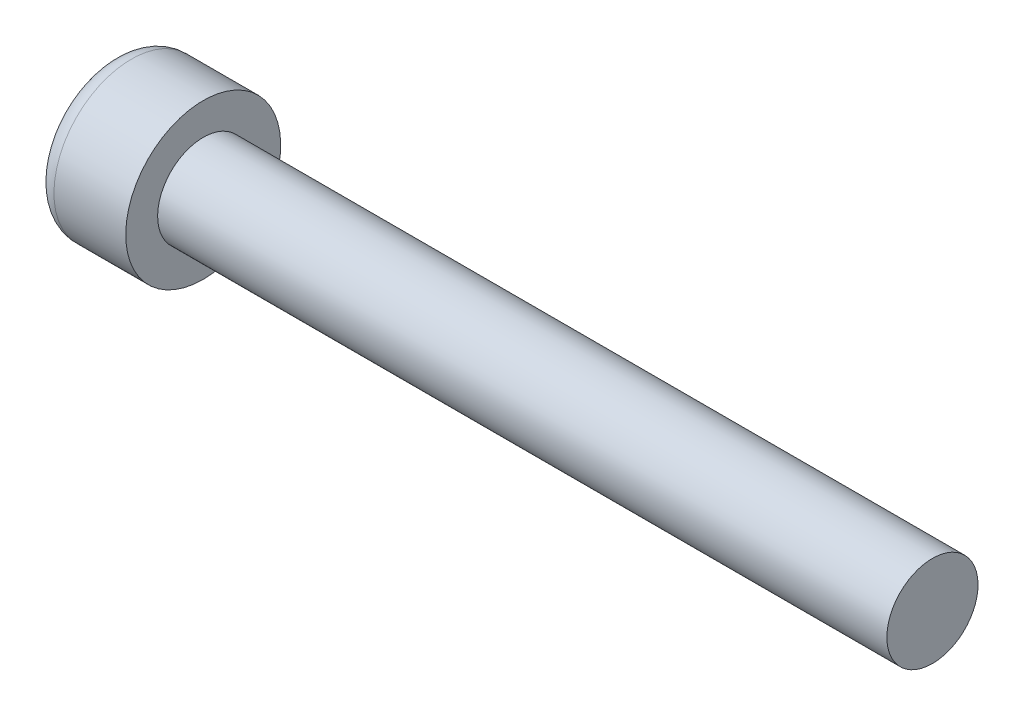
ISO-10303-21;
HEADER;
FILE_DESCRIPTION(('STEP AP214'),'2;1');
FILE_NAME('part.step','',(''),(''),'','','');
FILE_SCHEMA(('AUTOMOTIVE_DESIGN { 1 0 10303 214 1 1 1 1 }'));
ENDSEC;
DATA;
#1=APPLICATION_CONTEXT('core data for automotive mechanical design processes');
#2=APPLICATION_PROTOCOL_DEFINITION('international standard','automotive_design',2000,#1);
#3=PRODUCT_CONTEXT('',#1,'mechanical');
#4=PRODUCT('Part','Part','',(#3));
#5=PRODUCT_RELATED_PRODUCT_CATEGORY('part','',(#4));
#6=PRODUCT_DEFINITION_FORMATION('','',#4);
#7=PRODUCT_DEFINITION_CONTEXT('part definition',#1,'design');
#8=PRODUCT_DEFINITION('design','',#6,#7);
#9=PRODUCT_DEFINITION_SHAPE('','',#8);
#10=(LENGTH_UNIT() NAMED_UNIT(*) SI_UNIT(.MILLI.,.METRE.));
#11=(NAMED_UNIT(*) PLANE_ANGLE_UNIT() SI_UNIT($,.RADIAN.));
#12=(NAMED_UNIT(*) SI_UNIT($,.STERADIAN.) SOLID_ANGLE_UNIT());
#13=UNCERTAINTY_MEASURE_WITH_UNIT(LENGTH_MEASURE(1.E-05),#10,'distance_accuracy_value','');
#14=(GEOMETRIC_REPRESENTATION_CONTEXT(3) GLOBAL_UNCERTAINTY_ASSIGNED_CONTEXT((#13)) GLOBAL_UNIT_ASSIGNED_CONTEXT((#10,
#11,#12)) REPRESENTATION_CONTEXT('',''));
#15=CARTESIAN_POINT('',(0.,0.,0.));
#16=DIRECTION('',(0.,0.,1.));
#17=DIRECTION('',(1.,0.,0.));
#18=AXIS2_PLACEMENT_3D('',#15,#16,#17);
#19=CARTESIAN_POINT('',(0.,0.,0.));
#20=DIRECTION('',(1.,0.,0.));
#21=DIRECTION('',(0.,1.,0.));
#22=AXIS2_PLACEMENT_3D('',#19,#20,#21);
#23=PLANE('',#22);
#24=DIRECTION('',(0.,-0.5,-0.866025403784439));
#25=VECTOR('',#24,1.);
#26=CARTESIAN_POINT('',(0.,2.3094010767585,0.));
#27=LINE('',#26,#25);
#28=CARTESIAN_POINT('',(0.,2.3094010767585,0.));
#29=VERTEX_POINT('',#28);
#30=CARTESIAN_POINT('',(0.,1.15470053837925,-2.));
#31=VERTEX_POINT('',#30);
#32=EDGE_CURVE('E121',#29,#31,#27,.T.);
#33=ORIENTED_EDGE('',*,*,#32,.F.);
#34=DIRECTION('',(0.,0.5,-0.866025403784439));
#35=VECTOR('',#34,1.);
#36=CARTESIAN_POINT('',(0.,1.15470053837925,2.));
#37=LINE('',#36,#35);
#38=CARTESIAN_POINT('',(0.,1.15470053837925,2.));
#39=VERTEX_POINT('',#38);
#40=EDGE_CURVE('E47',#39,#29,#37,.T.);
#41=ORIENTED_EDGE('',*,*,#40,.F.);
#42=DIRECTION('',(0.,1.,0.));
#43=VECTOR('',#42,1.);
#44=CARTESIAN_POINT('',(0.,-1.15470053837925,2.));
#45=LINE('',#44,#43);
#46=CARTESIAN_POINT('',(0.,-1.15470053837925,2.));
#47=VERTEX_POINT('',#46);
#48=EDGE_CURVE('E130',#47,#39,#45,.T.);
#49=ORIENTED_EDGE('',*,*,#48,.F.);
#50=DIRECTION('',(0.,0.5,0.866025403784439));
#51=VECTOR('',#50,1.);
#52=CARTESIAN_POINT('',(0.,-2.3094010767585,0.));
#53=LINE('',#52,#51);
#54=CARTESIAN_POINT('',(0.,-2.3094010767585,0.));
#55=VERTEX_POINT('',#54);
#56=EDGE_CURVE('E128',#55,#47,#53,.T.);
#57=ORIENTED_EDGE('',*,*,#56,.F.);
#58=DIRECTION('',(0.,-0.5,0.866025403784439));
#59=VECTOR('',#58,1.);
#60=CARTESIAN_POINT('',(0.,-1.15470053837925,-2.));
#61=LINE('',#60,#59);
#62=CARTESIAN_POINT('',(0.,-1.15470053837925,-2.));
#63=VERTEX_POINT('',#62);
#64=EDGE_CURVE('E95',#63,#55,#61,.T.);
#65=ORIENTED_EDGE('',*,*,#64,.F.);
#66=DIRECTION('',(0.,-1.,0.));
#67=VECTOR('',#66,1.);
#68=CARTESIAN_POINT('',(0.,1.15470053837925,-2.));
#69=LINE('',#68,#67);
#70=EDGE_CURVE('E124',#31,#63,#69,.T.);
#71=ORIENTED_EDGE('',*,*,#70,.F.);
#72=EDGE_LOOP('',(#33,#41,#49,#57,#65,#71));
#73=FACE_BOUND('',#72,.T.);
#74=CARTESIAN_POINT('',(0.,0.,0.));
#75=DIRECTION('',(-1.,0.,0.));
#76=DIRECTION('',(0.,-1.,0.));
#77=AXIS2_PLACEMENT_3D('',#74,#75,#76);
#78=CIRCLE('',#77,3.1875);
#79=CARTESIAN_POINT('',(0.,-3.1875,0.));
#80=VERTEX_POINT('',#79);
#81=EDGE_CURVE('E11',#80,#80,#78,.T.);
#82=ORIENTED_EDGE('',*,*,#81,.T.);
#83=EDGE_LOOP('',(#82));
#84=FACE_BOUND('',#83,.T.);
#85=ADVANCED_FACE('F33',(#73,#84),#23,.F.);
#86=CARTESIAN_POINT('',(1.0625,0.,0.));
#87=DIRECTION('',(-1.,0.,0.));
#88=DIRECTION('',(0.,-1.,0.));
#89=AXIS2_PLACEMENT_3D('',#86,#87,#88);
#90=TOROIDAL_SURFACE('',#89,3.1875,1.0625);
#91=ORIENTED_EDGE('',*,*,#81,.F.);
#92=EDGE_LOOP('',(#91));
#93=FACE_BOUND('',#92,.T.);
#94=CARTESIAN_POINT('',(1.0625,0.,0.));
#95=DIRECTION('',(-1.,0.,0.));
#96=DIRECTION('',(0.,-1.,0.));
#97=AXIS2_PLACEMENT_3D('',#94,#95,#96);
#98=CIRCLE('',#97,4.25);
#99=CARTESIAN_POINT('',(1.0625,-4.25,0.));
#100=VERTEX_POINT('',#99);
#101=EDGE_CURVE('E40',#100,#100,#98,.T.);
#102=ORIENTED_EDGE('',*,*,#101,.T.);
#103=EDGE_LOOP('',(#102));
#104=FACE_BOUND('',#103,.T.);
#105=ADVANCED_FACE('F150',(#93,#104),#90,.T.);
#106=CARTESIAN_POINT('',(0.,0.,0.));
#107=DIRECTION('',(-1.,0.,0.));
#108=DIRECTION('',(0.,-1.,0.));
#109=AXIS2_PLACEMENT_3D('',#106,#107,#108);
#110=CYLINDRICAL_SURFACE('',#109,4.25);
#111=ORIENTED_EDGE('',*,*,#101,.F.);
#112=EDGE_LOOP('',(#111));
#113=FACE_BOUND('',#112,.T.);
#114=CARTESIAN_POINT('',(5.,0.,0.));
#115=DIRECTION('',(-1.,0.,0.));
#116=DIRECTION('',(0.,-1.,0.));
#117=AXIS2_PLACEMENT_3D('',#114,#115,#116);
#118=CIRCLE('',#117,4.25);
#119=CARTESIAN_POINT('',(5.,-4.25,0.));
#120=VERTEX_POINT('',#119);
#121=EDGE_CURVE('E145',#120,#120,#118,.T.);
#122=ORIENTED_EDGE('',*,*,#121,.T.);
#123=EDGE_LOOP('',(#122));
#124=FACE_BOUND('',#123,.T.);
#125=ADVANCED_FACE('F152',(#113,#124),#110,.T.);
#126=CARTESIAN_POINT('',(5.,4.25,0.));
#127=DIRECTION('',(-1.,0.,0.));
#128=DIRECTION('',(0.,-1.,0.));
#129=AXIS2_PLACEMENT_3D('',#126,#127,#128);
#130=PLANE('',#129);
#131=ORIENTED_EDGE('',*,*,#121,.F.);
#132=EDGE_LOOP('',(#131));
#133=FACE_BOUND('',#132,.T.);
#134=CARTESIAN_POINT('',(5.,0.,0.));
#135=DIRECTION('',(-1.,0.,0.));
#136=DIRECTION('',(0.,-1.,0.));
#137=AXIS2_PLACEMENT_3D('',#134,#135,#136);
#138=CIRCLE('',#137,2.5);
#139=CARTESIAN_POINT('',(5.,-2.5,0.));
#140=VERTEX_POINT('',#139);
#141=EDGE_CURVE('E142',#140,#140,#138,.T.);
#142=ORIENTED_EDGE('',*,*,#141,.T.);
#143=EDGE_LOOP('',(#142));
#144=FACE_BOUND('',#143,.T.);
#145=ADVANCED_FACE('F155',(#133,#144),#130,.F.);
#146=CARTESIAN_POINT('',(0.,0.,0.));
#147=DIRECTION('',(-1.,0.,0.));
#148=DIRECTION('',(0.,-1.,0.));
#149=AXIS2_PLACEMENT_3D('',#146,#147,#148);
#150=CYLINDRICAL_SURFACE('',#149,2.49999999999999);
#151=ORIENTED_EDGE('',*,*,#141,.F.);
#152=EDGE_LOOP('',(#151));
#153=FACE_BOUND('',#152,.T.);
#154=CARTESIAN_POINT('',(45.,0.,0.));
#155=DIRECTION('',(-1.,0.,0.));
#156=DIRECTION('',(0.,-1.,0.));
#157=AXIS2_PLACEMENT_3D('',#154,#155,#156);
#158=CIRCLE('',#157,2.49999999999999);
#159=CARTESIAN_POINT('',(45.,-2.49999999999998,0.));
#160=VERTEX_POINT('',#159);
#161=EDGE_CURVE('E134',#160,#160,#158,.T.);
#162=ORIENTED_EDGE('',*,*,#161,.T.);
#163=EDGE_LOOP('',(#162));
#164=FACE_BOUND('',#163,.T.);
#165=ADVANCED_FACE('F161',(#153,#164),#150,.T.);
#166=CARTESIAN_POINT('',(45.,2.5,0.));
#167=DIRECTION('',(-1.,0.,0.));
#168=DIRECTION('',(0.,-1.,0.));
#169=AXIS2_PLACEMENT_3D('',#166,#167,#168);
#170=PLANE('',#169);
#171=ORIENTED_EDGE('',*,*,#161,.F.);
#172=EDGE_LOOP('',(#171));
#173=FACE_BOUND('',#172,.T.);
#174=ADVANCED_FACE('F167',(#173),#170,.F.);
#175=CARTESIAN_POINT('',(2.5,1.15470053837925,2.));
#176=DIRECTION('',(0.,0.866025403784439,0.5));
#177=DIRECTION('',(0.,-0.5,0.866025403784439));
#178=AXIS2_PLACEMENT_3D('',#175,#176,#177);
#179=PLANE('',#178);
#180=ORIENTED_EDGE('',*,*,#40,.T.);
#181=DIRECTION('',(-1.,0.,0.));
#182=VECTOR('',#181,1.);
#183=CARTESIAN_POINT('',(2.5,2.3094010767585,0.));
#184=LINE('',#183,#182);
#185=CARTESIAN_POINT('',(2.5,2.3094010767585,0.));
#186=VERTEX_POINT('',#185);
#187=EDGE_CURVE('E77',#186,#29,#184,.T.);
#188=ORIENTED_EDGE('',*,*,#187,.F.);
#189=DIRECTION('',(0.,0.5,-0.866025403784439));
#190=VECTOR('',#189,1.);
#191=CARTESIAN_POINT('',(2.5,1.15470053837925,2.));
#192=LINE('',#191,#190);
#193=CARTESIAN_POINT('',(2.5,1.15470053837925,2.));
#194=VERTEX_POINT('',#193);
#195=EDGE_CURVE('E132',#194,#186,#192,.T.);
#196=ORIENTED_EDGE('',*,*,#195,.F.);
#197=DIRECTION('',(-1.,0.,0.));
#198=VECTOR('',#197,1.);
#199=CARTESIAN_POINT('',(2.5,1.15470053837925,2.));
#200=LINE('',#199,#198);
#201=EDGE_CURVE('E55',#194,#39,#200,.T.);
#202=ORIENTED_EDGE('',*,*,#201,.T.);
#203=EDGE_LOOP('',(#180,#188,#196,#202));
#204=FACE_BOUND('',#203,.T.);
#205=ADVANCED_FACE('F172',(#204),#179,.F.);
#206=CARTESIAN_POINT('',(2.5,-1.15470053837925,2.));
#207=DIRECTION('',(0.,0.,1.));
#208=DIRECTION('',(1.,0.,0.));
#209=AXIS2_PLACEMENT_3D('',#206,#207,#208);
#210=PLANE('',#209);
#211=ORIENTED_EDGE('',*,*,#48,.T.);
#212=ORIENTED_EDGE('',*,*,#201,.F.);
#213=DIRECTION('',(0.,1.,0.));
#214=VECTOR('',#213,1.);
#215=CARTESIAN_POINT('',(2.5,-1.15470053837925,2.));
#216=LINE('',#215,#214);
#217=CARTESIAN_POINT('',(2.5,-1.15470053837925,2.));
#218=VERTEX_POINT('',#217);
#219=EDGE_CURVE('E107',#218,#194,#216,.T.);
#220=ORIENTED_EDGE('',*,*,#219,.F.);
#221=DIRECTION('',(-1.,0.,0.));
#222=VECTOR('',#221,1.);
#223=CARTESIAN_POINT('',(2.5,-1.15470053837925,2.));
#224=LINE('',#223,#222);
#225=EDGE_CURVE('E99',#218,#47,#224,.T.);
#226=ORIENTED_EDGE('',*,*,#225,.T.);
#227=EDGE_LOOP('',(#211,#212,#220,#226));
#228=FACE_BOUND('',#227,.T.);
#229=ADVANCED_FACE('F177',(#228),#210,.F.);
#230=CARTESIAN_POINT('',(2.5,-2.3094010767585,0.));
#231=DIRECTION('',(0.,-0.866025403784439,0.5));
#232=DIRECTION('',(0.,-0.5,-0.866025403784439));
#233=AXIS2_PLACEMENT_3D('',#230,#231,#232);
#234=PLANE('',#233);
#235=ORIENTED_EDGE('',*,*,#56,.T.);
#236=ORIENTED_EDGE('',*,*,#225,.F.);
#237=DIRECTION('',(0.,0.5,0.866025403784439));
#238=VECTOR('',#237,1.);
#239=CARTESIAN_POINT('',(2.5,-2.3094010767585,0.));
#240=LINE('',#239,#238);
#241=CARTESIAN_POINT('',(2.5,-2.3094010767585,0.));
#242=VERTEX_POINT('',#241);
#243=EDGE_CURVE('E103',#242,#218,#240,.T.);
#244=ORIENTED_EDGE('',*,*,#243,.F.);
#245=DIRECTION('',(-1.,0.,0.));
#246=VECTOR('',#245,1.);
#247=CARTESIAN_POINT('',(2.5,-2.3094010767585,0.));
#248=LINE('',#247,#246);
#249=EDGE_CURVE('E88',#242,#55,#248,.T.);
#250=ORIENTED_EDGE('',*,*,#249,.T.);
#251=EDGE_LOOP('',(#235,#236,#244,#250));
#252=FACE_BOUND('',#251,.T.);
#253=ADVANCED_FACE('F104',(#252),#234,.F.);
#254=CARTESIAN_POINT('',(2.5,-1.15470053837925,-2.));
#255=DIRECTION('',(0.,-0.866025403784438,-0.5));
#256=DIRECTION('',(0.,0.5,-0.866025403784438));
#257=AXIS2_PLACEMENT_3D('',#254,#255,#256);
#258=PLANE('',#257);
#259=ORIENTED_EDGE('',*,*,#64,.T.);
#260=ORIENTED_EDGE('',*,*,#249,.F.);
#261=DIRECTION('',(0.,-0.5,0.866025403784439));
#262=VECTOR('',#261,1.);
#263=CARTESIAN_POINT('',(2.5,-1.15470053837925,-2.));
#264=LINE('',#263,#262);
#265=CARTESIAN_POINT('',(2.5,-1.15470053837925,-2.));
#266=VERTEX_POINT('',#265);
#267=EDGE_CURVE('E92',#266,#242,#264,.T.);
#268=ORIENTED_EDGE('',*,*,#267,.F.);
#269=DIRECTION('',(-1.,0.,0.));
#270=VECTOR('',#269,1.);
#271=CARTESIAN_POINT('',(2.5,-1.15470053837925,-2.));
#272=LINE('',#271,#270);
#273=EDGE_CURVE('E100',#266,#63,#272,.T.);
#274=ORIENTED_EDGE('',*,*,#273,.T.);
#275=EDGE_LOOP('',(#259,#260,#268,#274));
#276=FACE_BOUND('',#275,.T.);
#277=ADVANCED_FACE('F90',(#276),#258,.F.);
#278=CARTESIAN_POINT('',(2.5,1.15470053837925,-2.));
#279=DIRECTION('',(0.,0.,-1.));
#280=DIRECTION('',(-1.,0.,0.));
#281=AXIS2_PLACEMENT_3D('',#278,#279,#280);
#282=PLANE('',#281);
#283=ORIENTED_EDGE('',*,*,#70,.T.);
#284=ORIENTED_EDGE('',*,*,#273,.F.);
#285=DIRECTION('',(0.,-1.,0.));
#286=VECTOR('',#285,1.);
#287=CARTESIAN_POINT('',(2.5,1.15470053837925,-2.));
#288=LINE('',#287,#286);
#289=CARTESIAN_POINT('',(2.5,1.15470053837925,-2.));
#290=VERTEX_POINT('',#289);
#291=EDGE_CURVE('E113',#290,#266,#288,.T.);
#292=ORIENTED_EDGE('',*,*,#291,.F.);
#293=DIRECTION('',(-1.,0.,0.));
#294=VECTOR('',#293,1.);
#295=CARTESIAN_POINT('',(2.5,1.15470053837925,-2.));
#296=LINE('',#295,#294);
#297=EDGE_CURVE('E137',#290,#31,#296,.T.);
#298=ORIENTED_EDGE('',*,*,#297,.T.);
#299=EDGE_LOOP('',(#283,#284,#292,#298));
#300=FACE_BOUND('',#299,.T.);
#301=ADVANCED_FACE('F203',(#300),#282,.F.);
#302=CARTESIAN_POINT('',(2.5,2.3094010767585,0.));
#303=DIRECTION('',(0.,0.866025403784439,-0.5));
#304=DIRECTION('',(0.,0.5,0.866025403784439));
#305=AXIS2_PLACEMENT_3D('',#302,#303,#304);
#306=PLANE('',#305);
#307=ORIENTED_EDGE('',*,*,#32,.T.);
#308=ORIENTED_EDGE('',*,*,#297,.F.);
#309=DIRECTION('',(0.,-0.5,-0.866025403784439));
#310=VECTOR('',#309,1.);
#311=CARTESIAN_POINT('',(2.5,2.3094010767585,0.));
#312=LINE('',#311,#310);
#313=EDGE_CURVE('E115',#186,#290,#312,.T.);
#314=ORIENTED_EDGE('',*,*,#313,.F.);
#315=ORIENTED_EDGE('',*,*,#187,.T.);
#316=EDGE_LOOP('',(#307,#308,#314,#315));
#317=FACE_BOUND('',#316,.T.);
#318=ADVANCED_FACE('F191',(#317),#306,.F.);
#319=CARTESIAN_POINT('',(2.5,0.,0.));
#320=DIRECTION('',(-1.,0.,0.));
#321=DIRECTION('',(0.,-1.,0.));
#322=AXIS2_PLACEMENT_3D('',#319,#320,#321);
#323=PLANE('',#322);
#324=ORIENTED_EDGE('',*,*,#195,.T.);
#325=ORIENTED_EDGE('',*,*,#313,.T.);
#326=ORIENTED_EDGE('',*,*,#291,.T.);
#327=ORIENTED_EDGE('',*,*,#267,.T.);
#328=ORIENTED_EDGE('',*,*,#243,.T.);
#329=ORIENTED_EDGE('',*,*,#219,.T.);
#330=EDGE_LOOP('',(#324,#325,#326,#327,#328,#329));
#331=FACE_BOUND('',#330,.T.);
#332=ADVANCED_FACE('F110',(#331),#323,.T.);
#333=CLOSED_SHELL('',(#85,#105,#125,#145,#165,#174,#205,#229,#253,#277,#301,#318,#332));
#334=MANIFOLD_SOLID_BREP('B2',#333);
#335=ADVANCED_BREP_SHAPE_REPRESENTATION('',(#18,#334),#14);
#336=SHAPE_DEFINITION_REPRESENTATION(#9,#335);
ENDSEC;
END-ISO-10303-21;
